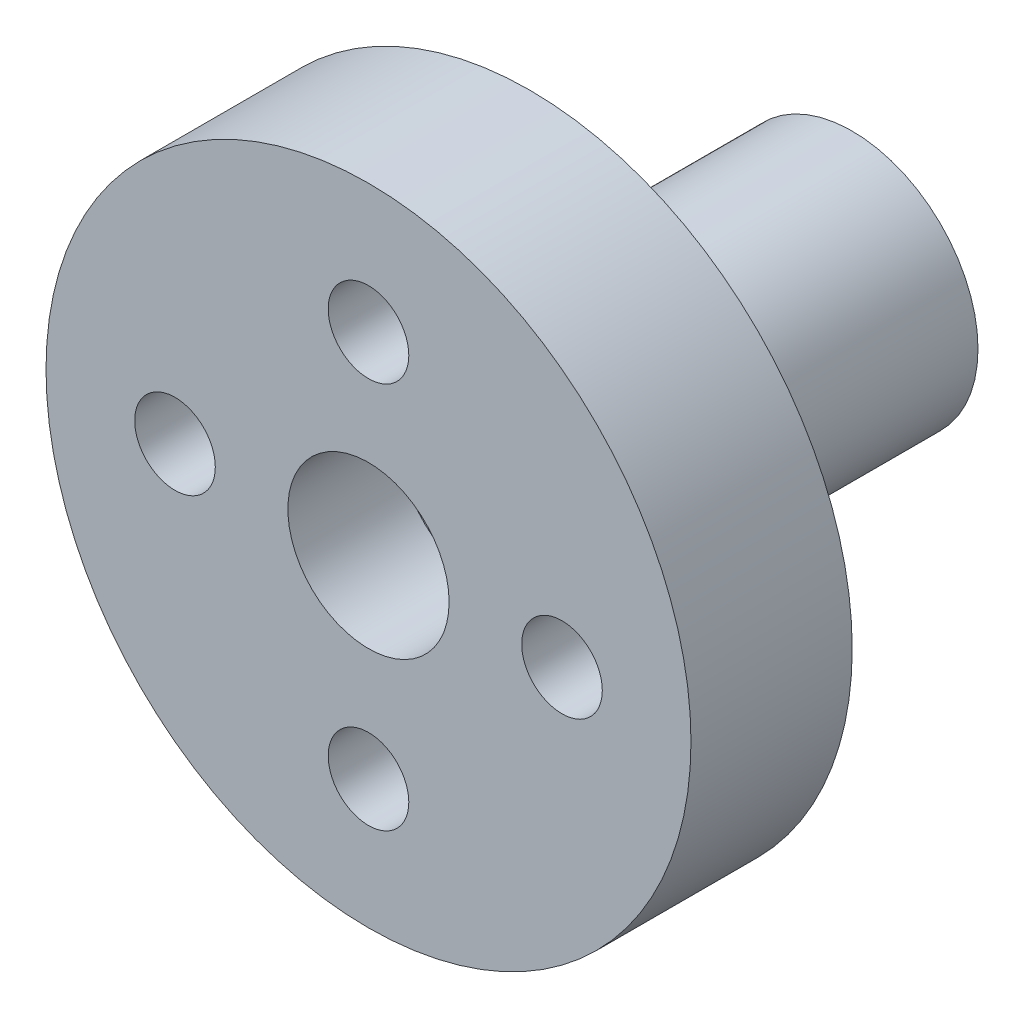
ISO-10303-21;
HEADER;
FILE_DESCRIPTION(('STEP AP214'),'2;1');
FILE_NAME('part.step','',(''),(''),'','','');
FILE_SCHEMA(('AUTOMOTIVE_DESIGN { 1 0 10303 214 1 1 1 1 }'));
ENDSEC;
DATA;
#1=APPLICATION_CONTEXT('core data for automotive mechanical design processes');
#2=APPLICATION_PROTOCOL_DEFINITION('international standard','automotive_design',2000,#1);
#3=PRODUCT_CONTEXT('',#1,'mechanical');
#4=PRODUCT('Part','Part','',(#3));
#5=PRODUCT_RELATED_PRODUCT_CATEGORY('part','',(#4));
#6=PRODUCT_DEFINITION_FORMATION('','',#4);
#7=PRODUCT_DEFINITION_CONTEXT('part definition',#1,'design');
#8=PRODUCT_DEFINITION('design','',#6,#7);
#9=PRODUCT_DEFINITION_SHAPE('','',#8);
#10=(LENGTH_UNIT() NAMED_UNIT(*) SI_UNIT(.MILLI.,.METRE.));
#11=(NAMED_UNIT(*) PLANE_ANGLE_UNIT() SI_UNIT($,.RADIAN.));
#12=(NAMED_UNIT(*) SI_UNIT($,.STERADIAN.) SOLID_ANGLE_UNIT());
#13=UNCERTAINTY_MEASURE_WITH_UNIT(LENGTH_MEASURE(1.E-05),#10,'distance_accuracy_value','');
#14=(GEOMETRIC_REPRESENTATION_CONTEXT(3) GLOBAL_UNCERTAINTY_ASSIGNED_CONTEXT((#13)) GLOBAL_UNIT_ASSIGNED_CONTEXT((#10,
#11,#12)) REPRESENTATION_CONTEXT('',''));
#15=CARTESIAN_POINT('',(0.,0.,0.));
#16=DIRECTION('',(0.,0.,1.));
#17=DIRECTION('',(1.,0.,0.));
#18=AXIS2_PLACEMENT_3D('',#15,#16,#17);
#19=CARTESIAN_POINT('',(0.,51.7783419919186,0.));
#20=DIRECTION('',(0.,0.,1.));
#21=DIRECTION('',(1.,0.,0.));
#22=AXIS2_PLACEMENT_3D('',#19,#20,#21);
#23=PLANE('',#22);
#24=CARTESIAN_POINT('',(0.,51.7783419919186,0.));
#25=DIRECTION('',(0.,0.,1.));
#26=DIRECTION('',(1.,0.,0.));
#27=AXIS2_PLACEMENT_3D('',#24,#25,#26);
#28=CIRCLE('',#27,3.9);
#29=CARTESIAN_POINT('',(3.9,51.7783419919186,0.));
#30=VERTEX_POINT('',#29);
#31=EDGE_CURVE('E37',#30,#30,#28,.T.);
#32=ORIENTED_EDGE('',*,*,#31,.F.);
#33=EDGE_LOOP('',(#32));
#34=FACE_BOUND('',#33,.T.);
#35=CARTESIAN_POINT('',(0.,51.7783419919186,0.));
#36=DIRECTION('',(0.,0.,1.));
#37=DIRECTION('',(1.,0.,0.));
#38=AXIS2_PLACEMENT_3D('',#35,#36,#37);
#39=CIRCLE('',#38,2.65);
#40=CARTESIAN_POINT('',(2.65,51.7783419919186,0.));
#41=VERTEX_POINT('',#40);
#42=EDGE_CURVE('E44',#41,#41,#39,.T.);
#43=ORIENTED_EDGE('',*,*,#42,.T.);
#44=EDGE_LOOP('',(#43));
#45=FACE_BOUND('',#44,.T.);
#46=ADVANCED_FACE('F33',(#34,#45),#23,.F.);
#47=CARTESIAN_POINT('',(0.,51.7783419919186,10.));
#48=DIRECTION('',(0.,0.,-1.));
#49=DIRECTION('',(-1.,0.,0.));
#50=AXIS2_PLACEMENT_3D('',#47,#48,#49);
#51=CYLINDRICAL_SURFACE('',#50,3.9);
#52=CARTESIAN_POINT('',(0.,51.7783419919186,10.));
#53=DIRECTION('',(0.,0.,1.));
#54=DIRECTION('',(1.,0.,0.));
#55=AXIS2_PLACEMENT_3D('',#52,#53,#54);
#56=CIRCLE('',#55,3.9);
#57=CARTESIAN_POINT('',(3.9,51.7783419919186,10.));
#58=VERTEX_POINT('',#57);
#59=EDGE_CURVE('E10',#58,#58,#56,.T.);
#60=ORIENTED_EDGE('',*,*,#59,.F.);
#61=EDGE_LOOP('',(#60));
#62=FACE_BOUND('',#61,.T.);
#63=ORIENTED_EDGE('',*,*,#31,.T.);
#64=EDGE_LOOP('',(#63));
#65=FACE_BOUND('',#64,.T.);
#66=ADVANCED_FACE('F35',(#62,#65),#51,.T.);
#67=CARTESIAN_POINT('',(0.,51.7783419919186,10.));
#68=DIRECTION('',(0.,0.,-1.));
#69=DIRECTION('',(-1.,0.,0.));
#70=AXIS2_PLACEMENT_3D('',#67,#68,#69);
#71=CYLINDRICAL_SURFACE('',#70,2.65);
#72=CARTESIAN_POINT('',(0.,51.7783419919186,10.));
#73=DIRECTION('',(0.,0.,1.));
#74=DIRECTION('',(1.,0.,0.));
#75=AXIS2_PLACEMENT_3D('',#72,#73,#74);
#76=CIRCLE('',#75,2.65);
#77=CARTESIAN_POINT('',(2.65,51.7783419919186,10.));
#78=VERTEX_POINT('',#77);
#79=EDGE_CURVE('E48',#78,#78,#76,.T.);
#80=ORIENTED_EDGE('',*,*,#79,.T.);
#81=EDGE_LOOP('',(#80));
#82=FACE_BOUND('',#81,.T.);
#83=ORIENTED_EDGE('',*,*,#42,.F.);
#84=EDGE_LOOP('',(#83));
#85=FACE_BOUND('',#84,.T.);
#86=ADVANCED_FACE('F130',(#82,#85),#71,.F.);
#87=CARTESIAN_POINT('',(0.,51.7783419919186,10.));
#88=DIRECTION('',(0.,0.,1.));
#89=DIRECTION('',(1.,0.,0.));
#90=AXIS2_PLACEMENT_3D('',#87,#88,#89);
#91=PLANE('',#90);
#92=ORIENTED_EDGE('',*,*,#79,.F.);
#93=EDGE_LOOP('',(#92));
#94=FACE_BOUND('',#93,.T.);
#95=ADVANCED_FACE('F115',(#94),#91,.F.);
#96=CARTESIAN_POINT('',(0.,51.7783419919186,15.));
#97=DIRECTION('',(0.,0.,-1.));
#98=DIRECTION('',(-1.,0.,0.));
#99=AXIS2_PLACEMENT_3D('',#96,#97,#98);
#100=CYLINDRICAL_SURFACE('',#99,10.);
#101=CARTESIAN_POINT('',(0.,51.7783419919186,15.));
#102=DIRECTION('',(0.,0.,1.));
#103=DIRECTION('',(1.,0.,0.));
#104=AXIS2_PLACEMENT_3D('',#101,#102,#103);
#105=CIRCLE('',#104,10.);
#106=CARTESIAN_POINT('',(10.,51.7783419919186,15.));
#107=VERTEX_POINT('',#106);
#108=EDGE_CURVE('E51',#107,#107,#105,.T.);
#109=ORIENTED_EDGE('',*,*,#108,.F.);
#110=EDGE_LOOP('',(#109));
#111=FACE_BOUND('',#110,.T.);
#112=CARTESIAN_POINT('',(0.,51.7783419919186,10.));
#113=DIRECTION('',(0.,0.,1.));
#114=DIRECTION('',(1.,0.,0.));
#115=AXIS2_PLACEMENT_3D('',#112,#113,#114);
#116=CIRCLE('',#115,10.);
#117=CARTESIAN_POINT('',(10.,51.7783419919186,10.));
#118=VERTEX_POINT('',#117);
#119=EDGE_CURVE('E52',#118,#118,#116,.T.);
#120=ORIENTED_EDGE('',*,*,#119,.T.);
#121=EDGE_LOOP('',(#120));
#122=FACE_BOUND('',#121,.T.);
#123=ADVANCED_FACE('F101',(#111,#122),#100,.T.);
#124=CARTESIAN_POINT('',(0.,51.7783419919186,15.));
#125=DIRECTION('',(0.,0.,1.));
#126=DIRECTION('',(1.,0.,0.));
#127=AXIS2_PLACEMENT_3D('',#124,#125,#126);
#128=PLANE('',#127);
#129=CARTESIAN_POINT('',(0.,51.7783419919186,15.));
#130=DIRECTION('',(0.,0.,1.));
#131=DIRECTION('',(1.,0.,0.));
#132=AXIS2_PLACEMENT_3D('',#129,#130,#131);
#133=CIRCLE('',#132,2.5);
#134=CARTESIAN_POINT('',(2.5,51.7783419919186,15.));
#135=VERTEX_POINT('',#134);
#136=EDGE_CURVE('E82',#135,#135,#133,.T.);
#137=ORIENTED_EDGE('',*,*,#136,.F.);
#138=EDGE_LOOP('',(#137));
#139=FACE_BOUND('',#138,.T.);
#140=CARTESIAN_POINT('',(-6.,51.7783419919186,15.));
#141=DIRECTION('',(0.,0.,1.));
#142=DIRECTION('',(1.,0.,0.));
#143=AXIS2_PLACEMENT_3D('',#140,#141,#142);
#144=CIRCLE('',#143,1.25);
#145=CARTESIAN_POINT('',(-4.75,51.7783419919186,15.));
#146=VERTEX_POINT('',#145);
#147=EDGE_CURVE('E77',#146,#146,#144,.T.);
#148=ORIENTED_EDGE('',*,*,#147,.F.);
#149=EDGE_LOOP('',(#148));
#150=FACE_BOUND('',#149,.T.);
#151=CARTESIAN_POINT('',(0.,57.7783419919186,15.));
#152=DIRECTION('',(0.,0.,1.));
#153=DIRECTION('',(1.,0.,0.));
#154=AXIS2_PLACEMENT_3D('',#151,#152,#153);
#155=CIRCLE('',#154,1.25000000000006);
#156=CARTESIAN_POINT('',(1.25000000000006,57.7783419919186,15.));
#157=VERTEX_POINT('',#156);
#158=EDGE_CURVE('E74',#157,#157,#155,.T.);
#159=ORIENTED_EDGE('',*,*,#158,.F.);
#160=EDGE_LOOP('',(#159));
#161=FACE_BOUND('',#160,.T.);
#162=CARTESIAN_POINT('',(0.,45.7783419919186,15.));
#163=DIRECTION('',(0.,0.,1.));
#164=DIRECTION('',(1.,0.,0.));
#165=AXIS2_PLACEMENT_3D('',#162,#163,#164);
#166=CIRCLE('',#165,1.25);
#167=CARTESIAN_POINT('',(1.25,45.7783419919186,15.));
#168=VERTEX_POINT('',#167);
#169=EDGE_CURVE('E68',#168,#168,#166,.T.);
#170=ORIENTED_EDGE('',*,*,#169,.F.);
#171=EDGE_LOOP('',(#170));
#172=FACE_BOUND('',#171,.T.);
#173=CARTESIAN_POINT('',(6.,51.7783419919186,15.));
#174=DIRECTION('',(0.,0.,1.));
#175=DIRECTION('',(1.,0.,0.));
#176=AXIS2_PLACEMENT_3D('',#173,#174,#175);
#177=CIRCLE('',#176,1.25);
#178=CARTESIAN_POINT('',(7.25,51.7783419919186,15.));
#179=VERTEX_POINT('',#178);
#180=EDGE_CURVE('E61',#179,#179,#177,.T.);
#181=ORIENTED_EDGE('',*,*,#180,.F.);
#182=EDGE_LOOP('',(#181));
#183=FACE_BOUND('',#182,.T.);
#184=ORIENTED_EDGE('',*,*,#108,.T.);
#185=EDGE_LOOP('',(#184));
#186=FACE_BOUND('',#185,.T.);
#187=ADVANCED_FACE('F97',(#139,#150,#161,#172,#183,#186),#128,.T.);
#188=ORIENTED_EDGE('',*,*,#59,.T.);
#189=EDGE_LOOP('',(#188));
#190=FACE_BOUND('',#189,.T.);
#191=ORIENTED_EDGE('',*,*,#119,.F.);
#192=EDGE_LOOP('',(#191));
#193=FACE_BOUND('',#192,.T.);
#194=ADVANCED_FACE('F100',(#190,#193),#91,.F.);
#195=CARTESIAN_POINT('',(6.,51.7783419919186,12.));
#196=DIRECTION('',(0.,0.,1.));
#197=DIRECTION('',(1.,0.,0.));
#198=AXIS2_PLACEMENT_3D('',#195,#196,#197);
#199=CYLINDRICAL_SURFACE('',#198,1.25);
#200=CARTESIAN_POINT('',(6.,51.7783419919186,12.));
#201=DIRECTION('',(0.,0.,1.));
#202=DIRECTION('',(1.,0.,0.));
#203=AXIS2_PLACEMENT_3D('',#200,#201,#202);
#204=CIRCLE('',#203,1.25);
#205=CARTESIAN_POINT('',(7.25,51.7783419919186,12.));
#206=VERTEX_POINT('',#205);
#207=EDGE_CURVE('E58',#206,#206,#204,.T.);
#208=ORIENTED_EDGE('',*,*,#207,.F.);
#209=EDGE_LOOP('',(#208));
#210=FACE_BOUND('',#209,.T.);
#211=ORIENTED_EDGE('',*,*,#180,.T.);
#212=EDGE_LOOP('',(#211));
#213=FACE_BOUND('',#212,.T.);
#214=ADVANCED_FACE('F120',(#210,#213),#199,.F.);
#215=CARTESIAN_POINT('',(6.,51.7783419919186,12.));
#216=DIRECTION('',(0.,0.,1.));
#217=DIRECTION('',(1.,0.,0.));
#218=AXIS2_PLACEMENT_3D('',#215,#216,#217);
#219=PLANE('',#218);
#220=ORIENTED_EDGE('',*,*,#207,.T.);
#221=EDGE_LOOP('',(#220));
#222=FACE_BOUND('',#221,.T.);
#223=ADVANCED_FACE('F126',(#222),#219,.T.);
#224=CARTESIAN_POINT('',(0.,45.7783419919186,12.));
#225=DIRECTION('',(0.,0.,1.));
#226=DIRECTION('',(1.,0.,0.));
#227=AXIS2_PLACEMENT_3D('',#224,#225,#226);
#228=CYLINDRICAL_SURFACE('',#227,1.25);
#229=CARTESIAN_POINT('',(0.,45.7783419919186,12.));
#230=DIRECTION('',(0.,0.,1.));
#231=DIRECTION('',(1.,0.,0.));
#232=AXIS2_PLACEMENT_3D('',#229,#230,#231);
#233=CIRCLE('',#232,1.25);
#234=CARTESIAN_POINT('',(1.25,45.7783419919186,12.));
#235=VERTEX_POINT('',#234);
#236=EDGE_CURVE('E65',#235,#235,#233,.T.);
#237=ORIENTED_EDGE('',*,*,#236,.F.);
#238=EDGE_LOOP('',(#237));
#239=FACE_BOUND('',#238,.T.);
#240=ORIENTED_EDGE('',*,*,#169,.T.);
#241=EDGE_LOOP('',(#240));
#242=FACE_BOUND('',#241,.T.);
#243=ADVANCED_FACE('F201',(#239,#242),#228,.F.);
#244=CARTESIAN_POINT('',(0.,45.7783419919186,12.));
#245=DIRECTION('',(0.,0.,1.));
#246=DIRECTION('',(1.,0.,0.));
#247=AXIS2_PLACEMENT_3D('',#244,#245,#246);
#248=PLANE('',#247);
#249=ORIENTED_EDGE('',*,*,#236,.T.);
#250=EDGE_LOOP('',(#249));
#251=FACE_BOUND('',#250,.T.);
#252=ADVANCED_FACE('F196',(#251),#248,.T.);
#253=CARTESIAN_POINT('',(0.,57.7783419919186,12.));
#254=DIRECTION('',(0.,0.,1.));
#255=DIRECTION('',(1.,0.,0.));
#256=AXIS2_PLACEMENT_3D('',#253,#254,#255);
#257=CYLINDRICAL_SURFACE('',#256,1.25000000000006);
#258=CARTESIAN_POINT('',(0.,57.7783419919186,12.));
#259=DIRECTION('',(0.,0.,1.));
#260=DIRECTION('',(1.,0.,0.));
#261=AXIS2_PLACEMENT_3D('',#258,#259,#260);
#262=CIRCLE('',#261,1.25000000000006);
#263=CARTESIAN_POINT('',(1.25000000000006,57.7783419919186,12.));
#264=VERTEX_POINT('',#263);
#265=EDGE_CURVE('E71',#264,#264,#262,.T.);
#266=ORIENTED_EDGE('',*,*,#265,.F.);
#267=EDGE_LOOP('',(#266));
#268=FACE_BOUND('',#267,.T.);
#269=ORIENTED_EDGE('',*,*,#158,.T.);
#270=EDGE_LOOP('',(#269));
#271=FACE_BOUND('',#270,.T.);
#272=ADVANCED_FACE('F193',(#268,#271),#257,.F.);
#273=CARTESIAN_POINT('',(0.,57.7783419919186,12.));
#274=DIRECTION('',(0.,0.,1.));
#275=DIRECTION('',(1.,0.,0.));
#276=AXIS2_PLACEMENT_3D('',#273,#274,#275);
#277=PLANE('',#276);
#278=ORIENTED_EDGE('',*,*,#265,.T.);
#279=EDGE_LOOP('',(#278));
#280=FACE_BOUND('',#279,.T.);
#281=ADVANCED_FACE('F191',(#280),#277,.T.);
#282=CARTESIAN_POINT('',(-6.,51.7783419919186,12.));
#283=DIRECTION('',(0.,0.,1.));
#284=DIRECTION('',(1.,0.,0.));
#285=AXIS2_PLACEMENT_3D('',#282,#283,#284);
#286=CYLINDRICAL_SURFACE('',#285,1.25);
#287=CARTESIAN_POINT('',(-6.,51.7783419919186,12.));
#288=DIRECTION('',(0.,0.,1.));
#289=DIRECTION('',(1.,0.,0.));
#290=AXIS2_PLACEMENT_3D('',#287,#288,#289);
#291=CIRCLE('',#290,1.25);
#292=CARTESIAN_POINT('',(-4.75,51.7783419919186,12.));
#293=VERTEX_POINT('',#292);
#294=EDGE_CURVE('E55',#293,#293,#291,.T.);
#295=ORIENTED_EDGE('',*,*,#294,.F.);
#296=EDGE_LOOP('',(#295));
#297=FACE_BOUND('',#296,.T.);
#298=ORIENTED_EDGE('',*,*,#147,.T.);
#299=EDGE_LOOP('',(#298));
#300=FACE_BOUND('',#299,.T.);
#301=ADVANCED_FACE('F187',(#297,#300),#286,.F.);
#302=CARTESIAN_POINT('',(-6.,51.7783419919186,12.));
#303=DIRECTION('',(0.,0.,1.));
#304=DIRECTION('',(1.,0.,0.));
#305=AXIS2_PLACEMENT_3D('',#302,#303,#304);
#306=PLANE('',#305);
#307=ORIENTED_EDGE('',*,*,#294,.T.);
#308=EDGE_LOOP('',(#307));
#309=FACE_BOUND('',#308,.T.);
#310=ADVANCED_FACE('F93',(#309),#306,.T.);
#311=CARTESIAN_POINT('',(0.,51.7783419919186,11.5));
#312=DIRECTION('',(0.,0.,1.));
#313=DIRECTION('',(1.,0.,0.));
#314=AXIS2_PLACEMENT_3D('',#311,#312,#313);
#315=CYLINDRICAL_SURFACE('',#314,2.5);
#316=CARTESIAN_POINT('',(0.,51.7783419919186,11.5));
#317=DIRECTION('',(0.,0.,1.));
#318=DIRECTION('',(1.,0.,0.));
#319=AXIS2_PLACEMENT_3D('',#316,#317,#318);
#320=CIRCLE('',#319,2.5);
#321=CARTESIAN_POINT('',(2.5,51.7783419919186,11.5));
#322=VERTEX_POINT('',#321);
#323=EDGE_CURVE('E62',#322,#322,#320,.T.);
#324=ORIENTED_EDGE('',*,*,#323,.F.);
#325=EDGE_LOOP('',(#324));
#326=FACE_BOUND('',#325,.T.);
#327=ORIENTED_EDGE('',*,*,#136,.T.);
#328=EDGE_LOOP('',(#327));
#329=FACE_BOUND('',#328,.T.);
#330=ADVANCED_FACE('F90',(#326,#329),#315,.F.);
#331=CARTESIAN_POINT('',(0.,51.7783419919186,11.5));
#332=DIRECTION('',(0.,0.,1.));
#333=DIRECTION('',(1.,0.,0.));
#334=AXIS2_PLACEMENT_3D('',#331,#332,#333);
#335=PLANE('',#334);
#336=ORIENTED_EDGE('',*,*,#323,.T.);
#337=EDGE_LOOP('',(#336));
#338=FACE_BOUND('',#337,.T.);
#339=ADVANCED_FACE('F88',(#338),#335,.T.);
#340=CLOSED_SHELL('',(#46,#66,#86,#95,#123,#187,#194,#214,#223,#243,#252,#272,#281,#301,#310,
#330,#339));
#341=MANIFOLD_SOLID_BREP('B2',#340);
#342=ADVANCED_BREP_SHAPE_REPRESENTATION('',(#18,#341),#14);
#343=SHAPE_DEFINITION_REPRESENTATION(#9,#342);
ENDSEC;
END-ISO-10303-21;
